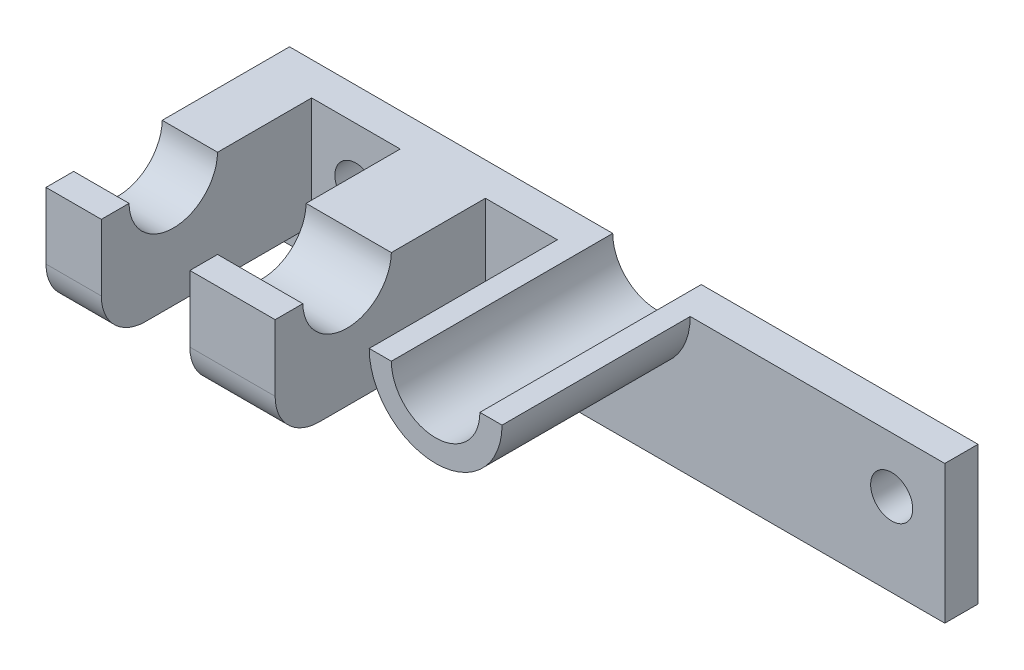
ISO-10303-21;
HEADER;
FILE_DESCRIPTION(('STEP AP214'),'2;1');
FILE_NAME('part.step','',(''),(''),'','','');
FILE_SCHEMA(('AUTOMOTIVE_DESIGN { 1 0 10303 214 1 1 1 1 }'));
ENDSEC;
DATA;
#1=APPLICATION_CONTEXT('core data for automotive mechanical design processes');
#2=APPLICATION_PROTOCOL_DEFINITION('international standard','automotive_design',2000,#1);
#3=PRODUCT_CONTEXT('',#1,'mechanical');
#4=PRODUCT('Part','Part','',(#3));
#5=PRODUCT_RELATED_PRODUCT_CATEGORY('part','',(#4));
#6=PRODUCT_DEFINITION_FORMATION('','',#4);
#7=PRODUCT_DEFINITION_CONTEXT('part definition',#1,'design');
#8=PRODUCT_DEFINITION('design','',#6,#7);
#9=PRODUCT_DEFINITION_SHAPE('','',#8);
#10=(LENGTH_UNIT() NAMED_UNIT(*) SI_UNIT(.MILLI.,.METRE.));
#11=(NAMED_UNIT(*) PLANE_ANGLE_UNIT() SI_UNIT($,.RADIAN.));
#12=(NAMED_UNIT(*) SI_UNIT($,.STERADIAN.) SOLID_ANGLE_UNIT());
#13=UNCERTAINTY_MEASURE_WITH_UNIT(LENGTH_MEASURE(1.E-05),#10,'distance_accuracy_value','');
#14=(GEOMETRIC_REPRESENTATION_CONTEXT(3) GLOBAL_UNCERTAINTY_ASSIGNED_CONTEXT((#13)) GLOBAL_UNIT_ASSIGNED_CONTEXT((#10,
#11,#12)) REPRESENTATION_CONTEXT('',''));
#15=CARTESIAN_POINT('',(0.,0.,0.));
#16=DIRECTION('',(0.,0.,1.));
#17=DIRECTION('',(1.,0.,0.));
#18=AXIS2_PLACEMENT_3D('',#15,#16,#17);
#19=CARTESIAN_POINT('',(0.,0.,3.));
#20=DIRECTION('',(0.,0.,1.));
#21=DIRECTION('',(1.,0.,0.));
#22=AXIS2_PLACEMENT_3D('',#19,#20,#21);
#23=PLANE('',#22);
#24=DIRECTION('',(1.,0.,0.));
#25=VECTOR('',#24,1.);
#26=CARTESIAN_POINT('',(0.,0.,3.));
#27=LINE('',#26,#25);
#28=CARTESIAN_POINT('',(-28.2,0.,3.));
#29=VERTEX_POINT('',#28);
#30=CARTESIAN_POINT('',(-20.2,0.,3.));
#31=VERTEX_POINT('',#30);
#32=EDGE_CURVE('E407',#29,#31,#27,.T.);
#33=ORIENTED_EDGE('',*,*,#32,.F.);
#34=DIRECTION('',(0.,1.,0.));
#35=VECTOR('',#34,1.);
#36=CARTESIAN_POINT('',(-28.2,9.9981412265895,3.));
#37=LINE('',#36,#35);
#38=CARTESIAN_POINT('',(-28.2,-9.9981412265895,3.));
#39=VERTEX_POINT('',#38);
#40=EDGE_CURVE('E229',#39,#29,#37,.T.);
#41=ORIENTED_EDGE('',*,*,#40,.F.);
#42=DIRECTION('',(1.,0.,0.));
#43=VECTOR('',#42,1.);
#44=CARTESIAN_POINT('',(-28.2,-9.9981412265895,3.));
#45=LINE('',#44,#43);
#46=CARTESIAN_POINT('',(-33.2,-9.9981412265895,3.));
#47=VERTEX_POINT('',#46);
#48=EDGE_CURVE('E225',#47,#39,#45,.T.);
#49=ORIENTED_EDGE('',*,*,#48,.F.);
#50=DIRECTION('',(0.,-1.,0.));
#51=VECTOR('',#50,1.);
#52=CARTESIAN_POINT('',(-33.2,12.5,3.));
#53=LINE('',#52,#51);
#54=CARTESIAN_POINT('',(-33.2,-12.5,3.));
#55=VERTEX_POINT('',#54);
#56=EDGE_CURVE('E239',#47,#55,#53,.T.);
#57=ORIENTED_EDGE('',*,*,#56,.T.);
#58=DIRECTION('',(1.,0.,0.));
#59=VECTOR('',#58,1.);
#60=CARTESIAN_POINT('',(-29.,-12.5,3.));
#61=LINE('',#60,#59);
#62=CARTESIAN_POINT('',(29.,-12.5,3.));
#63=VERTEX_POINT('',#62);
#64=EDGE_CURVE('E319',#55,#63,#61,.T.);
#65=ORIENTED_EDGE('',*,*,#64,.T.);
#66=DIRECTION('',(0.,1.,0.));
#67=VECTOR('',#66,1.);
#68=CARTESIAN_POINT('',(29.,12.5,3.));
#69=LINE('',#68,#67);
#70=CARTESIAN_POINT('',(29.,0.,3.));
#71=VERTEX_POINT('',#70);
#72=EDGE_CURVE('E315',#63,#71,#69,.T.);
#73=ORIENTED_EDGE('',*,*,#72,.T.);
#74=CARTESIAN_POINT('',(6.,0.,3.));
#75=VERTEX_POINT('',#74);
#76=EDGE_CURVE('E369',#75,#71,#27,.T.);
#77=ORIENTED_EDGE('',*,*,#76,.F.);
#78=CARTESIAN_POINT('',(0.,0.,3.));
#79=DIRECTION('',(0.,0.,1.));
#80=DIRECTION('',(1.,0.,0.));
#81=AXIS2_PLACEMENT_3D('',#78,#79,#80);
#82=CIRCLE('',#81,6.);
#83=CARTESIAN_POINT('',(-6.,0.,3.));
#84=VERTEX_POINT('',#83);
#85=EDGE_CURVE('E294',#75,#84,#82,.F.);
#86=ORIENTED_EDGE('',*,*,#85,.T.);
#87=CARTESIAN_POINT('',(-12.5,0.,3.));
#88=VERTEX_POINT('',#87);
#89=EDGE_CURVE('E394',#88,#84,#27,.T.);
#90=ORIENTED_EDGE('',*,*,#89,.F.);
#91=DIRECTION('',(0.,1.,0.));
#92=VECTOR('',#91,1.);
#93=CARTESIAN_POINT('',(-12.5,9.9981412265895,3.));
#94=LINE('',#93,#92);
#95=CARTESIAN_POINT('',(-12.5,-9.9981412265895,3.));
#96=VERTEX_POINT('',#95);
#97=EDGE_CURVE('E257',#96,#88,#94,.T.);
#98=ORIENTED_EDGE('',*,*,#97,.F.);
#99=DIRECTION('',(1.,0.,0.));
#100=VECTOR('',#99,1.);
#101=CARTESIAN_POINT('',(-20.2,-9.9981412265895,3.));
#102=LINE('',#101,#100);
#103=CARTESIAN_POINT('',(-20.2,-9.9981412265895,3.));
#104=VERTEX_POINT('',#103);
#105=EDGE_CURVE('E263',#104,#96,#102,.T.);
#106=ORIENTED_EDGE('',*,*,#105,.F.);
#107=DIRECTION('',(0.,-1.,0.));
#108=VECTOR('',#107,1.);
#109=CARTESIAN_POINT('',(-20.2,9.9981412265895,3.));
#110=LINE('',#109,#108);
#111=EDGE_CURVE('E270',#31,#104,#110,.T.);
#112=ORIENTED_EDGE('',*,*,#111,.F.);
#113=EDGE_LOOP('',(#33,#41,#49,#57,#65,#73,#77,#86,#90,#98,#106,#112));
#114=FACE_BOUND('',#113,.T.);
#115=CARTESIAN_POINT('',(24.2,-5.,3.));
#116=DIRECTION('',(0.,0.,1.));
#117=DIRECTION('',(1.,0.,0.));
#118=AXIS2_PLACEMENT_3D('',#115,#116,#117);
#119=CIRCLE('',#118,1.9);
#120=CARTESIAN_POINT('',(26.1,-5.,3.));
#121=VERTEX_POINT('',#120);
#122=EDGE_CURVE('E307',#121,#121,#119,.T.);
#123=ORIENTED_EDGE('',*,*,#122,.F.);
#124=EDGE_LOOP('',(#123));
#125=FACE_BOUND('',#124,.T.);
#126=CARTESIAN_POINT('',(-24.2,-5.,3.));
#127=DIRECTION('',(0.,0.,1.));
#128=DIRECTION('',(1.,0.,0.));
#129=AXIS2_PLACEMENT_3D('',#126,#127,#128);
#130=CIRCLE('',#129,1.9);
#131=CARTESIAN_POINT('',(-22.3,-5.,3.));
#132=VERTEX_POINT('',#131);
#133=EDGE_CURVE('E299',#132,#132,#130,.T.);
#134=ORIENTED_EDGE('',*,*,#133,.F.);
#135=EDGE_LOOP('',(#134));
#136=FACE_BOUND('',#135,.T.);
#137=ADVANCED_FACE('F44',(#114,#125,#136),#23,.T.);
#138=CARTESIAN_POINT('',(0.,0.,0.));
#139=DIRECTION('',(0.,0.,1.));
#140=DIRECTION('',(1.,0.,0.));
#141=AXIS2_PLACEMENT_3D('',#138,#139,#140);
#142=PLANE('',#141);
#143=DIRECTION('',(0.,-1.,0.));
#144=VECTOR('',#143,1.);
#145=CARTESIAN_POINT('',(-33.2,12.5,0.));
#146=LINE('',#145,#144);
#147=CARTESIAN_POINT('',(-33.2,0.,0.));
#148=VERTEX_POINT('',#147);
#149=CARTESIAN_POINT('',(-33.2,-12.5,0.));
#150=VERTEX_POINT('',#149);
#151=EDGE_CURVE('E240',#148,#150,#146,.T.);
#152=ORIENTED_EDGE('',*,*,#151,.F.);
#153=DIRECTION('',(-1.,0.,0.));
#154=VECTOR('',#153,1.);
#155=CARTESIAN_POINT('',(29.,0.,0.));
#156=LINE('',#155,#154);
#157=CARTESIAN_POINT('',(-4.,0.,0.));
#158=VERTEX_POINT('',#157);
#159=EDGE_CURVE('E416',#158,#148,#156,.T.);
#160=ORIENTED_EDGE('',*,*,#159,.F.);
#161=CARTESIAN_POINT('',(0.,0.,0.));
#162=DIRECTION('',(0.,0.,1.));
#163=DIRECTION('',(1.,0.,0.));
#164=AXIS2_PLACEMENT_3D('',#161,#162,#163);
#165=CIRCLE('',#164,4.);
#166=CARTESIAN_POINT('',(4.,0.,0.));
#167=VERTEX_POINT('',#166);
#168=EDGE_CURVE('E283',#158,#167,#165,.T.);
#169=ORIENTED_EDGE('',*,*,#168,.T.);
#170=CARTESIAN_POINT('',(29.,0.,0.));
#171=VERTEX_POINT('',#170);
#172=EDGE_CURVE('E60',#171,#167,#156,.T.);
#173=ORIENTED_EDGE('',*,*,#172,.F.);
#174=DIRECTION('',(0.,1.,0.));
#175=VECTOR('',#174,1.);
#176=CARTESIAN_POINT('',(29.,12.5,0.));
#177=LINE('',#176,#175);
#178=CARTESIAN_POINT('',(29.,-12.5,0.));
#179=VERTEX_POINT('',#178);
#180=EDGE_CURVE('E311',#179,#171,#177,.T.);
#181=ORIENTED_EDGE('',*,*,#180,.F.);
#182=DIRECTION('',(1.,0.,0.));
#183=VECTOR('',#182,1.);
#184=CARTESIAN_POINT('',(-29.,-12.5,0.));
#185=LINE('',#184,#183);
#186=EDGE_CURVE('E320',#150,#179,#185,.T.);
#187=ORIENTED_EDGE('',*,*,#186,.F.);
#188=EDGE_LOOP('',(#152,#160,#169,#173,#181,#187));
#189=FACE_BOUND('',#188,.T.);
#190=CARTESIAN_POINT('',(24.2,-5.,0.));
#191=DIRECTION('',(0.,0.,1.));
#192=DIRECTION('',(1.,0.,0.));
#193=AXIS2_PLACEMENT_3D('',#190,#191,#192);
#194=CIRCLE('',#193,1.9);
#195=CARTESIAN_POINT('',(26.1,-5.,0.));
#196=VERTEX_POINT('',#195);
#197=EDGE_CURVE('E303',#196,#196,#194,.T.);
#198=ORIENTED_EDGE('',*,*,#197,.T.);
#199=EDGE_LOOP('',(#198));
#200=FACE_BOUND('',#199,.T.);
#201=CARTESIAN_POINT('',(-24.2,-5.,0.));
#202=DIRECTION('',(0.,0.,1.));
#203=DIRECTION('',(1.,0.,0.));
#204=AXIS2_PLACEMENT_3D('',#201,#202,#203);
#205=CIRCLE('',#204,1.9);
#206=CARTESIAN_POINT('',(-22.3,-5.,0.));
#207=VERTEX_POINT('',#206);
#208=EDGE_CURVE('E298',#207,#207,#205,.T.);
#209=ORIENTED_EDGE('',*,*,#208,.T.);
#210=EDGE_LOOP('',(#209));
#211=FACE_BOUND('',#210,.T.);
#212=ADVANCED_FACE('F426',(#189,#200,#211),#142,.F.);
#213=CARTESIAN_POINT('',(29.,12.5,3.));
#214=DIRECTION('',(-1.,0.,0.));
#215=DIRECTION('',(0.,0.,1.));
#216=AXIS2_PLACEMENT_3D('',#213,#214,#215);
#217=PLANE('',#216);
#218=ORIENTED_EDGE('',*,*,#180,.T.);
#219=DIRECTION('',(0.,0.,-1.));
#220=VECTOR('',#219,1.);
#221=CARTESIAN_POINT('',(29.,0.,22.));
#222=LINE('',#221,#220);
#223=EDGE_CURVE('E412',#71,#171,#222,.T.);
#224=ORIENTED_EDGE('',*,*,#223,.F.);
#225=ORIENTED_EDGE('',*,*,#72,.F.);
#226=DIRECTION('',(0.,0.,-1.));
#227=VECTOR('',#226,1.);
#228=CARTESIAN_POINT('',(29.,-12.5,3.));
#229=LINE('',#228,#227);
#230=EDGE_CURVE('E323',#63,#179,#229,.T.);
#231=ORIENTED_EDGE('',*,*,#230,.T.);
#232=EDGE_LOOP('',(#218,#224,#225,#231));
#233=FACE_BOUND('',#232,.T.);
#234=ADVANCED_FACE('F459',(#233),#217,.F.);
#235=CARTESIAN_POINT('',(-29.,-12.5,3.));
#236=DIRECTION('',(0.,1.,0.));
#237=DIRECTION('',(0.,0.,1.));
#238=AXIS2_PLACEMENT_3D('',#235,#236,#237);
#239=PLANE('',#238);
#240=ORIENTED_EDGE('',*,*,#186,.T.);
#241=ORIENTED_EDGE('',*,*,#230,.F.);
#242=ORIENTED_EDGE('',*,*,#64,.F.);
#243=DIRECTION('',(0.,0.,1.));
#244=VECTOR('',#243,1.);
#245=CARTESIAN_POINT('',(-33.2,-12.5,0.));
#246=LINE('',#245,#244);
#247=EDGE_CURVE('E243',#150,#55,#246,.T.);
#248=ORIENTED_EDGE('',*,*,#247,.F.);
#249=EDGE_LOOP('',(#240,#241,#242,#248));
#250=FACE_BOUND('',#249,.T.);
#251=ADVANCED_FACE('F433',(#250),#239,.F.);
#252=CARTESIAN_POINT('',(24.2,-5.,3.));
#253=DIRECTION('',(0.,0.,-1.));
#254=DIRECTION('',(-1.,0.,0.));
#255=AXIS2_PLACEMENT_3D('',#252,#253,#254);
#256=CYLINDRICAL_SURFACE('',#255,1.9);
#257=ORIENTED_EDGE('',*,*,#122,.T.);
#258=EDGE_LOOP('',(#257));
#259=FACE_BOUND('',#258,.T.);
#260=ORIENTED_EDGE('',*,*,#197,.F.);
#261=EDGE_LOOP('',(#260));
#262=FACE_BOUND('',#261,.T.);
#263=ADVANCED_FACE('F462',(#259,#262),#256,.F.);
#264=CARTESIAN_POINT('',(-24.2,-5.,3.));
#265=DIRECTION('',(0.,0.,-1.));
#266=DIRECTION('',(-1.,0.,0.));
#267=AXIS2_PLACEMENT_3D('',#264,#265,#266);
#268=CYLINDRICAL_SURFACE('',#267,1.9);
#269=ORIENTED_EDGE('',*,*,#133,.T.);
#270=EDGE_LOOP('',(#269));
#271=FACE_BOUND('',#270,.T.);
#272=ORIENTED_EDGE('',*,*,#208,.F.);
#273=EDGE_LOOP('',(#272));
#274=FACE_BOUND('',#273,.T.);
#275=ADVANCED_FACE('F535',(#271,#274),#268,.F.);
#276=CARTESIAN_POINT('',(0.,0.,20.));
#277=DIRECTION('',(0.,0.,-1.));
#278=DIRECTION('',(-1.,0.,0.));
#279=AXIS2_PLACEMENT_3D('',#276,#277,#278);
#280=CYLINDRICAL_SURFACE('',#279,6.);
#281=CARTESIAN_POINT('',(0.,0.,20.));
#282=DIRECTION('',(0.,0.,1.));
#283=DIRECTION('',(1.,0.,0.));
#284=AXIS2_PLACEMENT_3D('',#281,#282,#283);
#285=CIRCLE('',#284,6.);
#286=CARTESIAN_POINT('',(-6.,0.,20.));
#287=VERTEX_POINT('',#286);
#288=CARTESIAN_POINT('',(6.,0.,20.));
#289=VERTEX_POINT('',#288);
#290=EDGE_CURVE('E287',#287,#289,#285,.T.);
#291=ORIENTED_EDGE('',*,*,#290,.F.);
#292=DIRECTION('',(0.,0.,-1.));
#293=VECTOR('',#292,1.);
#294=CARTESIAN_POINT('',(-6.,0.,20.));
#295=LINE('',#294,#293);
#296=EDGE_CURVE('E390',#287,#84,#295,.T.);
#297=ORIENTED_EDGE('',*,*,#296,.T.);
#298=ORIENTED_EDGE('',*,*,#85,.F.);
#299=DIRECTION('',(0.,0.,-1.));
#300=VECTOR('',#299,1.);
#301=CARTESIAN_POINT('',(6.,0.,20.));
#302=LINE('',#301,#300);
#303=EDGE_CURVE('E371',#75,#289,#302,.F.);
#304=ORIENTED_EDGE('',*,*,#303,.T.);
#305=EDGE_LOOP('',(#291,#297,#298,#304));
#306=FACE_BOUND('',#305,.T.);
#307=ADVANCED_FACE('F516',(#306),#280,.T.);
#308=CARTESIAN_POINT('',(0.,0.,20.));
#309=DIRECTION('',(0.,0.,1.));
#310=DIRECTION('',(1.,0.,0.));
#311=AXIS2_PLACEMENT_3D('',#308,#309,#310);
#312=PLANE('',#311);
#313=DIRECTION('',(1.,0.,0.));
#314=VECTOR('',#313,1.);
#315=CARTESIAN_POINT('',(0.,0.,20.));
#316=LINE('',#315,#314);
#317=CARTESIAN_POINT('',(-4.,0.,20.));
#318=VERTEX_POINT('',#317);
#319=EDGE_CURVE('E387',#287,#318,#316,.T.);
#320=ORIENTED_EDGE('',*,*,#319,.F.);
#321=ORIENTED_EDGE('',*,*,#290,.T.);
#322=CARTESIAN_POINT('',(4.,0.,20.));
#323=VERTEX_POINT('',#322);
#324=EDGE_CURVE('E375',#323,#289,#316,.T.);
#325=ORIENTED_EDGE('',*,*,#324,.F.);
#326=CARTESIAN_POINT('',(0.,0.,20.));
#327=DIRECTION('',(0.,0.,1.));
#328=DIRECTION('',(1.,0.,0.));
#329=AXIS2_PLACEMENT_3D('',#326,#327,#328);
#330=CIRCLE('',#329,4.);
#331=EDGE_CURVE('E282',#318,#323,#330,.T.);
#332=ORIENTED_EDGE('',*,*,#331,.F.);
#333=EDGE_LOOP('',(#320,#321,#325,#332));
#334=FACE_BOUND('',#333,.T.);
#335=ADVANCED_FACE('F520',(#334),#312,.T.);
#336=CARTESIAN_POINT('',(0.,0.,0.));
#337=DIRECTION('',(0.,0.,1.));
#338=DIRECTION('',(1.,0.,0.));
#339=AXIS2_PLACEMENT_3D('',#336,#337,#338);
#340=CYLINDRICAL_SURFACE('',#339,4.);
#341=ORIENTED_EDGE('',*,*,#331,.T.);
#342=DIRECTION('',(0.,0.,1.));
#343=VECTOR('',#342,1.);
#344=CARTESIAN_POINT('',(4.,0.,0.));
#345=LINE('',#344,#343);
#346=EDGE_CURVE('E376',#323,#167,#345,.F.);
#347=ORIENTED_EDGE('',*,*,#346,.T.);
#348=ORIENTED_EDGE('',*,*,#168,.F.);
#349=DIRECTION('',(0.,0.,1.));
#350=VECTOR('',#349,1.);
#351=CARTESIAN_POINT('',(-4.,0.,0.));
#352=LINE('',#351,#350);
#353=EDGE_CURVE('E383',#158,#318,#352,.T.);
#354=ORIENTED_EDGE('',*,*,#353,.T.);
#355=EDGE_LOOP('',(#341,#347,#348,#354));
#356=FACE_BOUND('',#355,.T.);
#357=ADVANCED_FACE('F523',(#356),#340,.F.);
#358=CARTESIAN_POINT('',(-12.5,9.9981412265895,22.));
#359=DIRECTION('',(-1.,0.,0.));
#360=DIRECTION('',(0.,-1.,0.));
#361=AXIS2_PLACEMENT_3D('',#358,#359,#360);
#362=PLANE('',#361);
#363=ORIENTED_EDGE('',*,*,#97,.T.);
#364=DIRECTION('',(0.,0.,1.));
#365=VECTOR('',#364,1.);
#366=CARTESIAN_POINT('',(-12.5,0.,22.));
#367=LINE('',#366,#365);
#368=CARTESIAN_POINT('',(-12.5,0.,11.5008167069537));
#369=VERTEX_POINT('',#368);
#370=EDGE_CURVE('E395',#88,#369,#367,.T.);
#371=ORIENTED_EDGE('',*,*,#370,.T.);
#372=CARTESIAN_POINT('',(-12.5,0.0808269052919655,15.5));
#373=DIRECTION('',(-1.,0.,0.));
#374=DIRECTION('',(0.,-1.,0.));
#375=AXIS2_PLACEMENT_3D('',#372,#373,#374);
#376=CIRCLE('',#375,4.);
#377=CARTESIAN_POINT('',(-12.5,0.,19.4991832930463));
#378=VERTEX_POINT('',#377);
#379=EDGE_CURVE('E249',#378,#369,#376,.F.);
#380=ORIENTED_EDGE('',*,*,#379,.F.);
#381=CARTESIAN_POINT('',(-12.5,0.,22.));
#382=VERTEX_POINT('',#381);
#383=EDGE_CURVE('E68',#378,#382,#367,.T.);
#384=ORIENTED_EDGE('',*,*,#383,.T.);
#385=DIRECTION('',(0.,1.,0.));
#386=VECTOR('',#385,1.);
#387=CARTESIAN_POINT('',(-12.5,9.9981412265895,22.));
#388=LINE('',#387,#386);
#389=CARTESIAN_POINT('',(-12.5,-5.9981412265895,22.));
#390=VERTEX_POINT('',#389);
#391=EDGE_CURVE('E258',#390,#382,#388,.T.);
#392=ORIENTED_EDGE('',*,*,#391,.F.);
#393=CARTESIAN_POINT('',(-12.5,-5.9981412265895,18.));
#394=DIRECTION('',(-1.,0.,0.));
#395=DIRECTION('',(0.,-1.,0.));
#396=AXIS2_PLACEMENT_3D('',#393,#394,#395);
#397=CIRCLE('',#396,4.);
#398=CARTESIAN_POINT('',(-12.5,-9.9981412265895,18.));
#399=VERTEX_POINT('',#398);
#400=EDGE_CURVE('E336',#390,#399,#397,.F.);
#401=ORIENTED_EDGE('',*,*,#400,.T.);
#402=DIRECTION('',(0.,0.,-1.));
#403=VECTOR('',#402,1.);
#404=CARTESIAN_POINT('',(-12.5,-9.9981412265895,22.));
#405=LINE('',#404,#403);
#406=EDGE_CURVE('E266',#399,#96,#405,.T.);
#407=ORIENTED_EDGE('',*,*,#406,.T.);
#408=EDGE_LOOP('',(#363,#371,#380,#384,#392,#401,#407));
#409=FACE_BOUND('',#408,.T.);
#410=ADVANCED_FACE('F498',(#409),#362,.F.);
#411=CARTESIAN_POINT('',(-20.2,9.9981412265895,22.));
#412=DIRECTION('',(1.,0.,0.));
#413=DIRECTION('',(0.,0.,-1.));
#414=AXIS2_PLACEMENT_3D('',#411,#412,#413);
#415=PLANE('',#414);
#416=DIRECTION('',(0.,-1.,0.));
#417=VECTOR('',#416,1.);
#418=CARTESIAN_POINT('',(-20.2,9.9981412265895,22.));
#419=LINE('',#418,#417);
#420=CARTESIAN_POINT('',(-20.2,0.,22.));
#421=VERTEX_POINT('',#420);
#422=CARTESIAN_POINT('',(-20.2,-5.9981412265895,22.));
#423=VERTEX_POINT('',#422);
#424=EDGE_CURVE('E262',#421,#423,#419,.T.);
#425=ORIENTED_EDGE('',*,*,#424,.F.);
#426=DIRECTION('',(0.,0.,-1.));
#427=VECTOR('',#426,1.);
#428=CARTESIAN_POINT('',(-20.2,0.,22.));
#429=LINE('',#428,#427);
#430=CARTESIAN_POINT('',(-20.2,0.,19.4991832930463));
#431=VERTEX_POINT('',#430);
#432=EDGE_CURVE('E382',#421,#431,#429,.T.);
#433=ORIENTED_EDGE('',*,*,#432,.T.);
#434=CARTESIAN_POINT('',(-20.2,0.0808269052919655,15.5));
#435=DIRECTION('',(-1.,0.,0.));
#436=DIRECTION('',(0.,0.,1.));
#437=AXIS2_PLACEMENT_3D('',#434,#435,#436);
#438=CIRCLE('',#437,4.);
#439=CARTESIAN_POINT('',(-20.2,0.,11.5008167069537));
#440=VERTEX_POINT('',#439);
#441=EDGE_CURVE('E253',#440,#431,#438,.T.);
#442=ORIENTED_EDGE('',*,*,#441,.F.);
#443=EDGE_CURVE('E403',#440,#31,#429,.T.);
#444=ORIENTED_EDGE('',*,*,#443,.T.);
#445=ORIENTED_EDGE('',*,*,#111,.T.);
#446=DIRECTION('',(0.,0.,-1.));
#447=VECTOR('',#446,1.);
#448=CARTESIAN_POINT('',(-20.2,-9.9981412265895,22.));
#449=LINE('',#448,#447);
#450=CARTESIAN_POINT('',(-20.2,-9.9981412265895,18.));
#451=VERTEX_POINT('',#450);
#452=EDGE_CURVE('E278',#451,#104,#449,.T.);
#453=ORIENTED_EDGE('',*,*,#452,.F.);
#454=CARTESIAN_POINT('',(-20.2,-5.9981412265895,18.));
#455=DIRECTION('',(1.,0.,0.));
#456=DIRECTION('',(0.,0.,-1.));
#457=AXIS2_PLACEMENT_3D('',#454,#455,#456);
#458=CIRCLE('',#457,4.);
#459=EDGE_CURVE('E342',#451,#423,#458,.F.);
#460=ORIENTED_EDGE('',*,*,#459,.T.);
#461=EDGE_LOOP('',(#425,#433,#442,#444,#445,#453,#460));
#462=FACE_BOUND('',#461,.T.);
#463=ADVANCED_FACE('F488',(#462),#415,.F.);
#464=CARTESIAN_POINT('',(-20.2,-9.9981412265895,22.));
#465=DIRECTION('',(0.,1.,0.));
#466=DIRECTION('',(0.,0.,1.));
#467=AXIS2_PLACEMENT_3D('',#464,#465,#466);
#468=PLANE('',#467);
#469=ORIENTED_EDGE('',*,*,#406,.F.);
#470=DIRECTION('',(1.,0.,0.));
#471=VECTOR('',#470,1.);
#472=CARTESIAN_POINT('',(-20.2,-9.9981412265895,18.));
#473=LINE('',#472,#471);
#474=EDGE_CURVE('E339',#399,#451,#473,.F.);
#475=ORIENTED_EDGE('',*,*,#474,.T.);
#476=ORIENTED_EDGE('',*,*,#452,.T.);
#477=ORIENTED_EDGE('',*,*,#105,.T.);
#478=EDGE_LOOP('',(#469,#475,#476,#477));
#479=FACE_BOUND('',#478,.T.);
#480=ADVANCED_FACE('F494',(#479),#468,.F.);
#481=CARTESIAN_POINT('',(0.,0.,22.));
#482=DIRECTION('',(0.,0.,1.));
#483=DIRECTION('',(1.,0.,0.));
#484=AXIS2_PLACEMENT_3D('',#481,#482,#483);
#485=PLANE('',#484);
#486=DIRECTION('',(-1.,0.,0.));
#487=VECTOR('',#486,1.);
#488=CARTESIAN_POINT('',(29.,0.,22.));
#489=LINE('',#488,#487);
#490=EDGE_CURVE('E210',#382,#421,#489,.T.);
#491=ORIENTED_EDGE('',*,*,#490,.T.);
#492=ORIENTED_EDGE('',*,*,#424,.T.);
#493=DIRECTION('',(1.,0.,0.));
#494=VECTOR('',#493,1.);
#495=CARTESIAN_POINT('',(-12.5,-5.9981412265895,22.));
#496=LINE('',#495,#494);
#497=EDGE_CURVE('E332',#423,#390,#496,.T.);
#498=ORIENTED_EDGE('',*,*,#497,.T.);
#499=ORIENTED_EDGE('',*,*,#391,.T.);
#500=EDGE_LOOP('',(#491,#492,#498,#499));
#501=FACE_BOUND('',#500,.T.);
#502=ADVANCED_FACE('F479',(#501),#485,.T.);
#503=CARTESIAN_POINT('',(29.001,0.0808269052919655,15.5));
#504=DIRECTION('',(-1.,0.,0.));
#505=DIRECTION('',(0.,0.,1.));
#506=AXIS2_PLACEMENT_3D('',#503,#504,#505);
#507=CYLINDRICAL_SURFACE('',#506,4.);
#508=ORIENTED_EDGE('',*,*,#441,.T.);
#509=DIRECTION('',(-1.,0.,0.));
#510=VECTOR('',#509,1.);
#511=CARTESIAN_POINT('',(29.001,0.,19.4991832930463));
#512=LINE('',#511,#510);
#513=EDGE_CURVE('E379',#431,#378,#512,.F.);
#514=ORIENTED_EDGE('',*,*,#513,.T.);
#515=ORIENTED_EDGE('',*,*,#379,.T.);
#516=DIRECTION('',(-1.,0.,0.));
#517=VECTOR('',#516,1.);
#518=CARTESIAN_POINT('',(29.001,0.,11.5008167069537));
#519=LINE('',#518,#517);
#520=EDGE_CURVE('E399',#369,#440,#519,.T.);
#521=ORIENTED_EDGE('',*,*,#520,.T.);
#522=EDGE_LOOP('',(#508,#514,#515,#521));
#523=FACE_BOUND('',#522,.T.);
#524=ADVANCED_FACE('F471',(#523),#507,.F.);
#525=CARTESIAN_POINT('',(0.,-5.9981412265895,18.));
#526=DIRECTION('',(-1.,0.,0.));
#527=DIRECTION('',(0.,0.,1.));
#528=AXIS2_PLACEMENT_3D('',#525,#526,#527);
#529=CYLINDRICAL_SURFACE('',#528,4.);
#530=ORIENTED_EDGE('',*,*,#459,.F.);
#531=ORIENTED_EDGE('',*,*,#474,.F.);
#532=ORIENTED_EDGE('',*,*,#400,.F.);
#533=ORIENTED_EDGE('',*,*,#497,.F.);
#534=EDGE_LOOP('',(#530,#531,#532,#533));
#535=FACE_BOUND('',#534,.T.);
#536=ADVANCED_FACE('F469',(#535),#529,.T.);
#537=CARTESIAN_POINT('',(-33.2,12.5,0.));
#538=DIRECTION('',(-1.,0.,0.));
#539=DIRECTION('',(0.,-1.,0.));
#540=AXIS2_PLACEMENT_3D('',#537,#538,#539);
#541=PLANE('',#540);
#542=DIRECTION('',(0.,0.,-1.));
#543=VECTOR('',#542,1.);
#544=CARTESIAN_POINT('',(-33.2,0.,22.));
#545=LINE('',#544,#543);
#546=CARTESIAN_POINT('',(-33.2,0.,11.5005053033187));
#547=VERTEX_POINT('',#546);
#548=EDGE_CURVE('E199',#547,#148,#545,.T.);
#549=ORIENTED_EDGE('',*,*,#548,.T.);
#550=ORIENTED_EDGE('',*,*,#151,.T.);
#551=ORIENTED_EDGE('',*,*,#247,.T.);
#552=ORIENTED_EDGE('',*,*,#56,.F.);
#553=DIRECTION('',(0.,0.,-1.));
#554=VECTOR('',#553,1.);
#555=CARTESIAN_POINT('',(-33.2,-9.9981412265895,22.));
#556=LINE('',#555,#554);
#557=CARTESIAN_POINT('',(-33.2,-9.9981412265895,18.));
#558=VERTEX_POINT('',#557);
#559=EDGE_CURVE('E223',#558,#47,#556,.T.);
#560=ORIENTED_EDGE('',*,*,#559,.F.);
#561=CARTESIAN_POINT('',(-33.2,-5.9981412265895,18.));
#562=DIRECTION('',(-1.,0.,0.));
#563=DIRECTION('',(0.,-1.,0.));
#564=AXIS2_PLACEMENT_3D('',#561,#562,#563);
#565=CIRCLE('',#564,4.);
#566=CARTESIAN_POINT('',(-33.2,-5.9981412265895,22.));
#567=VERTEX_POINT('',#566);
#568=EDGE_CURVE('E216',#558,#567,#565,.T.);
#569=ORIENTED_EDGE('',*,*,#568,.T.);
#570=DIRECTION('',(0.,-1.,0.));
#571=VECTOR('',#570,1.);
#572=CARTESIAN_POINT('',(-33.2,9.9981412265895,22.));
#573=LINE('',#572,#571);
#574=CARTESIAN_POINT('',(-33.2,0.,22.));
#575=VERTEX_POINT('',#574);
#576=EDGE_CURVE('E205',#575,#567,#573,.T.);
#577=ORIENTED_EDGE('',*,*,#576,.F.);
#578=CARTESIAN_POINT('',(-33.2,0.,19.4994946966813));
#579=VERTEX_POINT('',#578);
#580=EDGE_CURVE('E187',#575,#579,#545,.T.);
#581=ORIENTED_EDGE('',*,*,#580,.T.);
#582=CARTESIAN_POINT('',(-33.2,0.0635780718363604,15.5));
#583=DIRECTION('',(-1.,0.,0.));
#584=DIRECTION('',(0.,-1.,0.));
#585=AXIS2_PLACEMENT_3D('',#582,#583,#584);
#586=CIRCLE('',#585,4.);
#587=EDGE_CURVE('E361',#579,#547,#586,.F.);
#588=ORIENTED_EDGE('',*,*,#587,.T.);
#589=EDGE_LOOP('',(#549,#550,#551,#552,#560,#569,#577,#581,#588));
#590=FACE_BOUND('',#589,.T.);
#591=ADVANCED_FACE('F213',(#590),#541,.T.);
#592=CARTESIAN_POINT('',(-28.2,9.9981412265895,22.));
#593=DIRECTION('',(-1.,0.,0.));
#594=DIRECTION('',(0.,-1.,0.));
#595=AXIS2_PLACEMENT_3D('',#592,#593,#594);
#596=PLANE('',#595);
#597=ORIENTED_EDGE('',*,*,#40,.T.);
#598=DIRECTION('',(0.,0.,1.));
#599=VECTOR('',#598,1.);
#600=CARTESIAN_POINT('',(-28.2,0.,22.));
#601=LINE('',#600,#599);
#602=CARTESIAN_POINT('',(-28.2,0.,11.5005053033187));
#603=VERTEX_POINT('',#602);
#604=EDGE_CURVE('E365',#29,#603,#601,.T.);
#605=ORIENTED_EDGE('',*,*,#604,.T.);
#606=CARTESIAN_POINT('',(-28.2,0.0635780718363613,15.5));
#607=DIRECTION('',(1.,0.,0.));
#608=DIRECTION('',(0.,1.,0.));
#609=AXIS2_PLACEMENT_3D('',#606,#607,#608);
#610=CIRCLE('',#609,4.);
#611=CARTESIAN_POINT('',(-28.2,0.,19.4994946966813));
#612=VERTEX_POINT('',#611);
#613=EDGE_CURVE('E233',#612,#603,#610,.T.);
#614=ORIENTED_EDGE('',*,*,#613,.F.);
#615=CARTESIAN_POINT('',(-28.2,0.,22.));
#616=VERTEX_POINT('',#615);
#617=EDGE_CURVE('E198',#612,#616,#601,.T.);
#618=ORIENTED_EDGE('',*,*,#617,.T.);
#619=DIRECTION('',(0.,1.,0.));
#620=VECTOR('',#619,1.);
#621=CARTESIAN_POINT('',(-28.2,9.9981412265895,22.));
#622=LINE('',#621,#620);
#623=CARTESIAN_POINT('',(-28.2,-5.9981412265895,22.));
#624=VERTEX_POINT('',#623);
#625=EDGE_CURVE('E208',#624,#616,#622,.T.);
#626=ORIENTED_EDGE('',*,*,#625,.F.);
#627=CARTESIAN_POINT('',(-28.2,-5.9981412265895,18.));
#628=DIRECTION('',(-1.,0.,0.));
#629=DIRECTION('',(0.,-1.,0.));
#630=AXIS2_PLACEMENT_3D('',#627,#628,#629);
#631=CIRCLE('',#630,4.);
#632=CARTESIAN_POINT('',(-28.2,-9.9981412265895,18.));
#633=VERTEX_POINT('',#632);
#634=EDGE_CURVE('E349',#624,#633,#631,.F.);
#635=ORIENTED_EDGE('',*,*,#634,.T.);
#636=DIRECTION('',(0.,0.,-1.));
#637=VECTOR('',#636,1.);
#638=CARTESIAN_POINT('',(-28.2,-9.9981412265895,22.));
#639=LINE('',#638,#637);
#640=EDGE_CURVE('E219',#633,#39,#639,.T.);
#641=ORIENTED_EDGE('',*,*,#640,.T.);
#642=EDGE_LOOP('',(#597,#605,#614,#618,#626,#635,#641));
#643=FACE_BOUND('',#642,.T.);
#644=ADVANCED_FACE('F364',(#643),#596,.F.);
#645=CARTESIAN_POINT('',(-28.2,-9.9981412265895,22.));
#646=DIRECTION('',(0.,1.,0.));
#647=DIRECTION('',(0.,0.,1.));
#648=AXIS2_PLACEMENT_3D('',#645,#646,#647);
#649=PLANE('',#648);
#650=ORIENTED_EDGE('',*,*,#640,.F.);
#651=DIRECTION('',(1.,0.,0.));
#652=VECTOR('',#651,1.);
#653=CARTESIAN_POINT('',(-28.2,-9.9981412265895,18.));
#654=LINE('',#653,#652);
#655=EDGE_CURVE('E352',#633,#558,#654,.F.);
#656=ORIENTED_EDGE('',*,*,#655,.T.);
#657=ORIENTED_EDGE('',*,*,#559,.T.);
#658=ORIENTED_EDGE('',*,*,#48,.T.);
#659=EDGE_LOOP('',(#650,#656,#657,#658));
#660=FACE_BOUND('',#659,.T.);
#661=ADVANCED_FACE('F442',(#660),#649,.F.);
#662=CARTESIAN_POINT('',(0.,0.,22.));
#663=DIRECTION('',(0.,0.,-1.));
#664=DIRECTION('',(-1.,0.,0.));
#665=AXIS2_PLACEMENT_3D('',#662,#663,#664);
#666=PLANE('',#665);
#667=ORIENTED_EDGE('',*,*,#625,.T.);
#668=EDGE_CURVE('E190',#616,#575,#489,.T.);
#669=ORIENTED_EDGE('',*,*,#668,.T.);
#670=ORIENTED_EDGE('',*,*,#576,.T.);
#671=DIRECTION('',(1.,0.,0.));
#672=VECTOR('',#671,1.);
#673=CARTESIAN_POINT('',(0.,-5.9981412265895,22.));
#674=LINE('',#673,#672);
#675=EDGE_CURVE('E346',#567,#624,#674,.T.);
#676=ORIENTED_EDGE('',*,*,#675,.T.);
#677=EDGE_LOOP('',(#667,#669,#670,#676));
#678=FACE_BOUND('',#677,.T.);
#679=ADVANCED_FACE('F203',(#678),#666,.F.);
#680=CARTESIAN_POINT('',(-33.201,0.0635780718363604,15.5));
#681=DIRECTION('',(1.,0.,0.));
#682=DIRECTION('',(0.,1.,0.));
#683=AXIS2_PLACEMENT_3D('',#680,#681,#682);
#684=CYLINDRICAL_SURFACE('',#683,4.);
#685=ORIENTED_EDGE('',*,*,#613,.T.);
#686=DIRECTION('',(1.,0.,0.));
#687=VECTOR('',#686,1.);
#688=CARTESIAN_POINT('',(-33.201,0.,11.5005053033187));
#689=LINE('',#688,#687);
#690=EDGE_CURVE('E11',#603,#547,#689,.F.);
#691=ORIENTED_EDGE('',*,*,#690,.T.);
#692=ORIENTED_EDGE('',*,*,#587,.F.);
#693=DIRECTION('',(1.,0.,0.));
#694=VECTOR('',#693,1.);
#695=CARTESIAN_POINT('',(-33.201,0.,19.4994946966813));
#696=LINE('',#695,#694);
#697=EDGE_CURVE('E53',#579,#612,#696,.T.);
#698=ORIENTED_EDGE('',*,*,#697,.T.);
#699=EDGE_LOOP('',(#685,#691,#692,#698));
#700=FACE_BOUND('',#699,.T.);
#701=ADVANCED_FACE('F360',(#700),#684,.F.);
#702=CARTESIAN_POINT('',(0.,-5.9981412265895,18.));
#703=DIRECTION('',(1.,0.,0.));
#704=DIRECTION('',(0.,0.,-1.));
#705=AXIS2_PLACEMENT_3D('',#702,#703,#704);
#706=CYLINDRICAL_SURFACE('',#705,4.);
#707=ORIENTED_EDGE('',*,*,#568,.F.);
#708=ORIENTED_EDGE('',*,*,#655,.F.);
#709=ORIENTED_EDGE('',*,*,#634,.F.);
#710=ORIENTED_EDGE('',*,*,#675,.F.);
#711=EDGE_LOOP('',(#707,#708,#709,#710));
#712=FACE_BOUND('',#711,.T.);
#713=ADVANCED_FACE('F46',(#712),#706,.T.);
#714=CARTESIAN_POINT('',(29.,0.,22.));
#715=DIRECTION('',(0.,-1.,0.));
#716=DIRECTION('',(0.,0.,-1.));
#717=AXIS2_PLACEMENT_3D('',#714,#715,#716);
#718=PLANE('',#717);
#719=ORIENTED_EDGE('',*,*,#697,.F.);
#720=ORIENTED_EDGE('',*,*,#580,.F.);
#721=ORIENTED_EDGE('',*,*,#668,.F.);
#722=ORIENTED_EDGE('',*,*,#617,.F.);
#723=EDGE_LOOP('',(#719,#720,#721,#722));
#724=FACE_BOUND('',#723,.T.);
#725=ADVANCED_FACE('F189',(#724),#718,.F.);
#726=ORIENTED_EDGE('',*,*,#159,.T.);
#727=ORIENTED_EDGE('',*,*,#548,.F.);
#728=ORIENTED_EDGE('',*,*,#690,.F.);
#729=ORIENTED_EDGE('',*,*,#604,.F.);
#730=ORIENTED_EDGE('',*,*,#32,.T.);
#731=ORIENTED_EDGE('',*,*,#443,.F.);
#732=ORIENTED_EDGE('',*,*,#520,.F.);
#733=ORIENTED_EDGE('',*,*,#370,.F.);
#734=ORIENTED_EDGE('',*,*,#89,.T.);
#735=ORIENTED_EDGE('',*,*,#296,.F.);
#736=ORIENTED_EDGE('',*,*,#319,.T.);
#737=ORIENTED_EDGE('',*,*,#353,.F.);
#738=EDGE_LOOP('',(#726,#727,#728,#729,#730,#731,#732,#733,#734,#735,#736,#737));
#739=FACE_BOUND('',#738,.T.);
#740=ADVANCED_FACE('F420',(#739),#718,.F.);
#741=ORIENTED_EDGE('',*,*,#513,.F.);
#742=ORIENTED_EDGE('',*,*,#432,.F.);
#743=ORIENTED_EDGE('',*,*,#490,.F.);
#744=ORIENTED_EDGE('',*,*,#383,.F.);
#745=EDGE_LOOP('',(#741,#742,#743,#744));
#746=FACE_BOUND('',#745,.T.);
#747=ADVANCED_FACE('F685',(#746),#718,.F.);
#748=ORIENTED_EDGE('',*,*,#76,.T.);
#749=ORIENTED_EDGE('',*,*,#223,.T.);
#750=ORIENTED_EDGE('',*,*,#172,.T.);
#751=ORIENTED_EDGE('',*,*,#346,.F.);
#752=ORIENTED_EDGE('',*,*,#324,.T.);
#753=ORIENTED_EDGE('',*,*,#303,.F.);
#754=EDGE_LOOP('',(#748,#749,#750,#751,#752,#753));
#755=FACE_BOUND('',#754,.T.);
#756=ADVANCED_FACE('F452',(#755),#718,.F.);
#757=CLOSED_SHELL('',(#137,#212,#234,#251,#263,#275,#307,#335,#357,#410,#463,#480,#502,#524,
#536,#591,#644,#661,#679,#701,#713,#725,#740,#747,#756));
#758=MANIFOLD_SOLID_BREP('B2',#757);
#759=ADVANCED_BREP_SHAPE_REPRESENTATION('',(#18,#758),#14);
#760=SHAPE_DEFINITION_REPRESENTATION(#9,#759);
ENDSEC;
END-ISO-10303-21;
